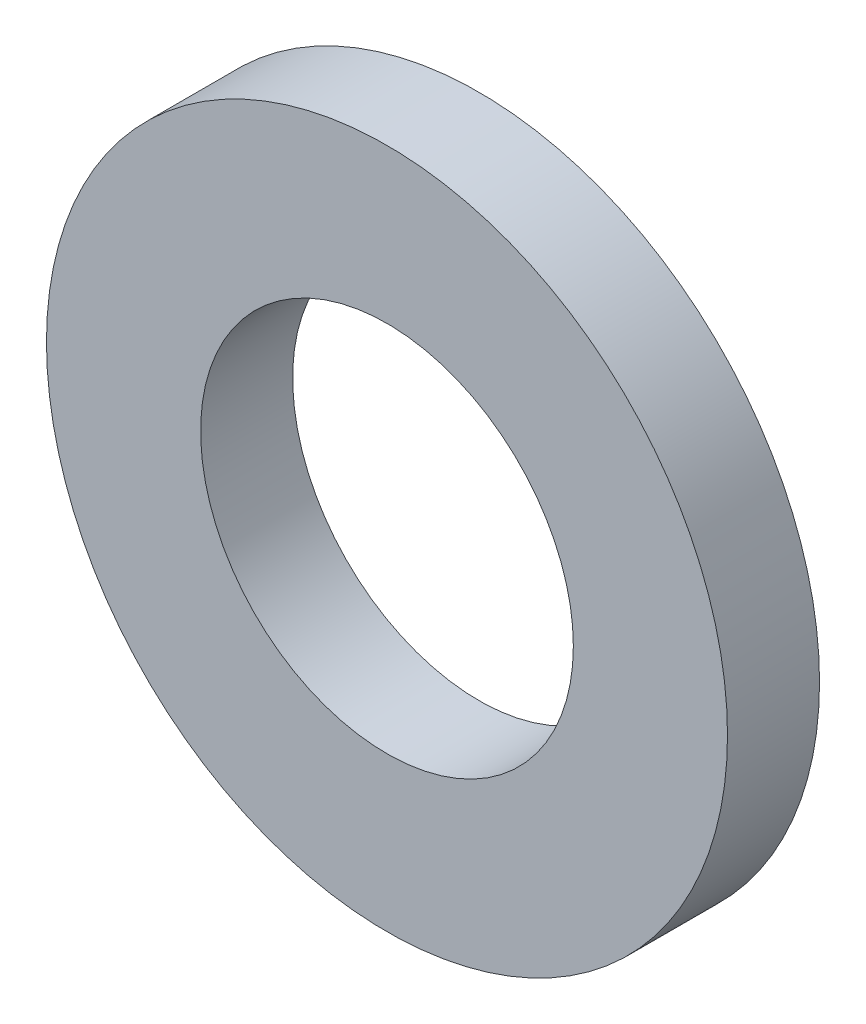
ISO-10303-21;
HEADER;
FILE_DESCRIPTION(('STEP AP214'),'2;1');
FILE_NAME('part.step','',(''),(''),'','','');
FILE_SCHEMA(('AUTOMOTIVE_DESIGN { 1 0 10303 214 1 1 1 1 }'));
ENDSEC;
DATA;
#1=APPLICATION_CONTEXT('core data for automotive mechanical design processes');
#2=APPLICATION_PROTOCOL_DEFINITION('international standard','automotive_design',2000,#1);
#3=PRODUCT_CONTEXT('',#1,'mechanical');
#4=PRODUCT('Part','Part','',(#3));
#5=PRODUCT_RELATED_PRODUCT_CATEGORY('part','',(#4));
#6=PRODUCT_DEFINITION_FORMATION('','',#4);
#7=PRODUCT_DEFINITION_CONTEXT('part definition',#1,'design');
#8=PRODUCT_DEFINITION('design','',#6,#7);
#9=PRODUCT_DEFINITION_SHAPE('','',#8);
#10=(LENGTH_UNIT() NAMED_UNIT(*) SI_UNIT(.MILLI.,.METRE.));
#11=(NAMED_UNIT(*) PLANE_ANGLE_UNIT() SI_UNIT($,.RADIAN.));
#12=(NAMED_UNIT(*) SI_UNIT($,.STERADIAN.) SOLID_ANGLE_UNIT());
#13=UNCERTAINTY_MEASURE_WITH_UNIT(LENGTH_MEASURE(1.E-05),#10,'distance_accuracy_value','');
#14=(GEOMETRIC_REPRESENTATION_CONTEXT(3) GLOBAL_UNCERTAINTY_ASSIGNED_CONTEXT((#13)) GLOBAL_UNIT_ASSIGNED_CONTEXT((#10,
#11,#12)) REPRESENTATION_CONTEXT('',''));
#15=CARTESIAN_POINT('',(0.,0.,0.));
#16=DIRECTION('',(0.,0.,1.));
#17=DIRECTION('',(1.,0.,0.));
#18=AXIS2_PLACEMENT_3D('',#15,#16,#17);
#19=CARTESIAN_POINT('',(0.,0.,2.));
#20=DIRECTION('',(0.,0.,1.));
#21=DIRECTION('',(1.,0.,0.));
#22=AXIS2_PLACEMENT_3D('',#19,#20,#21);
#23=PLANE('',#22);
#24=CARTESIAN_POINT('',(0.,0.,2.));
#25=DIRECTION('',(0.,0.,1.));
#26=DIRECTION('',(1.,0.,0.));
#27=AXIS2_PLACEMENT_3D('',#24,#25,#26);
#28=CIRCLE('',#27,7.4);
#29=CARTESIAN_POINT('',(7.4,0.,2.));
#30=VERTEX_POINT('',#29);
#31=EDGE_CURVE('E10',#30,#30,#28,.T.);
#32=ORIENTED_EDGE('',*,*,#31,.T.);
#33=EDGE_LOOP('',(#32));
#34=FACE_BOUND('',#33,.T.);
#35=CARTESIAN_POINT('',(0.,0.,2.));
#36=DIRECTION('',(0.,0.,1.));
#37=DIRECTION('',(1.,0.,0.));
#38=AXIS2_PLACEMENT_3D('',#35,#36,#37);
#39=CIRCLE('',#38,4.05);
#40=CARTESIAN_POINT('',(4.05,0.,2.));
#41=VERTEX_POINT('',#40);
#42=EDGE_CURVE('E44',#41,#41,#39,.T.);
#43=ORIENTED_EDGE('',*,*,#42,.F.);
#44=EDGE_LOOP('',(#43));
#45=FACE_BOUND('',#44,.T.);
#46=ADVANCED_FACE('F33',(#34,#45),#23,.T.);
#47=CARTESIAN_POINT('',(0.,0.,0.));
#48=DIRECTION('',(0.,0.,1.));
#49=DIRECTION('',(1.,0.,0.));
#50=AXIS2_PLACEMENT_3D('',#47,#48,#49);
#51=PLANE('',#50);
#52=CARTESIAN_POINT('',(0.,0.,0.));
#53=DIRECTION('',(0.,0.,1.));
#54=DIRECTION('',(1.,0.,0.));
#55=AXIS2_PLACEMENT_3D('',#52,#53,#54);
#56=CIRCLE('',#55,7.4);
#57=CARTESIAN_POINT('',(7.4,0.,0.));
#58=VERTEX_POINT('',#57);
#59=EDGE_CURVE('E37',#58,#58,#56,.T.);
#60=ORIENTED_EDGE('',*,*,#59,.F.);
#61=EDGE_LOOP('',(#60));
#62=FACE_BOUND('',#61,.T.);
#63=CARTESIAN_POINT('',(0.,0.,0.));
#64=DIRECTION('',(0.,0.,1.));
#65=DIRECTION('',(1.,0.,0.));
#66=AXIS2_PLACEMENT_3D('',#63,#64,#65);
#67=CIRCLE('',#66,4.05);
#68=CARTESIAN_POINT('',(4.05,0.,0.));
#69=VERTEX_POINT('',#68);
#70=EDGE_CURVE('E46',#69,#69,#67,.T.);
#71=ORIENTED_EDGE('',*,*,#70,.T.);
#72=EDGE_LOOP('',(#71));
#73=FACE_BOUND('',#72,.T.);
#74=ADVANCED_FACE('F56',(#62,#73),#51,.F.);
#75=CARTESIAN_POINT('',(0.,0.,2.));
#76=DIRECTION('',(0.,0.,-1.));
#77=DIRECTION('',(-1.,0.,0.));
#78=AXIS2_PLACEMENT_3D('',#75,#76,#77);
#79=CYLINDRICAL_SURFACE('',#78,7.4);
#80=ORIENTED_EDGE('',*,*,#31,.F.);
#81=EDGE_LOOP('',(#80));
#82=FACE_BOUND('',#81,.T.);
#83=ORIENTED_EDGE('',*,*,#59,.T.);
#84=EDGE_LOOP('',(#83));
#85=FACE_BOUND('',#84,.T.);
#86=ADVANCED_FACE('F35',(#82,#85),#79,.T.);
#87=CARTESIAN_POINT('',(0.,0.,2.));
#88=DIRECTION('',(0.,0.,-1.));
#89=DIRECTION('',(-1.,0.,0.));
#90=AXIS2_PLACEMENT_3D('',#87,#88,#89);
#91=CYLINDRICAL_SURFACE('',#90,4.05);
#92=ORIENTED_EDGE('',*,*,#42,.T.);
#93=EDGE_LOOP('',(#92));
#94=FACE_BOUND('',#93,.T.);
#95=ORIENTED_EDGE('',*,*,#70,.F.);
#96=EDGE_LOOP('',(#95));
#97=FACE_BOUND('',#96,.T.);
#98=ADVANCED_FACE('F52',(#94,#97),#91,.F.);
#99=CLOSED_SHELL('',(#46,#74,#86,#98));
#100=MANIFOLD_SOLID_BREP('B2',#99);
#101=ADVANCED_BREP_SHAPE_REPRESENTATION('',(#18,#100),#14);
#102=SHAPE_DEFINITION_REPRESENTATION(#9,#101);
ENDSEC;
END-ISO-10303-21;
